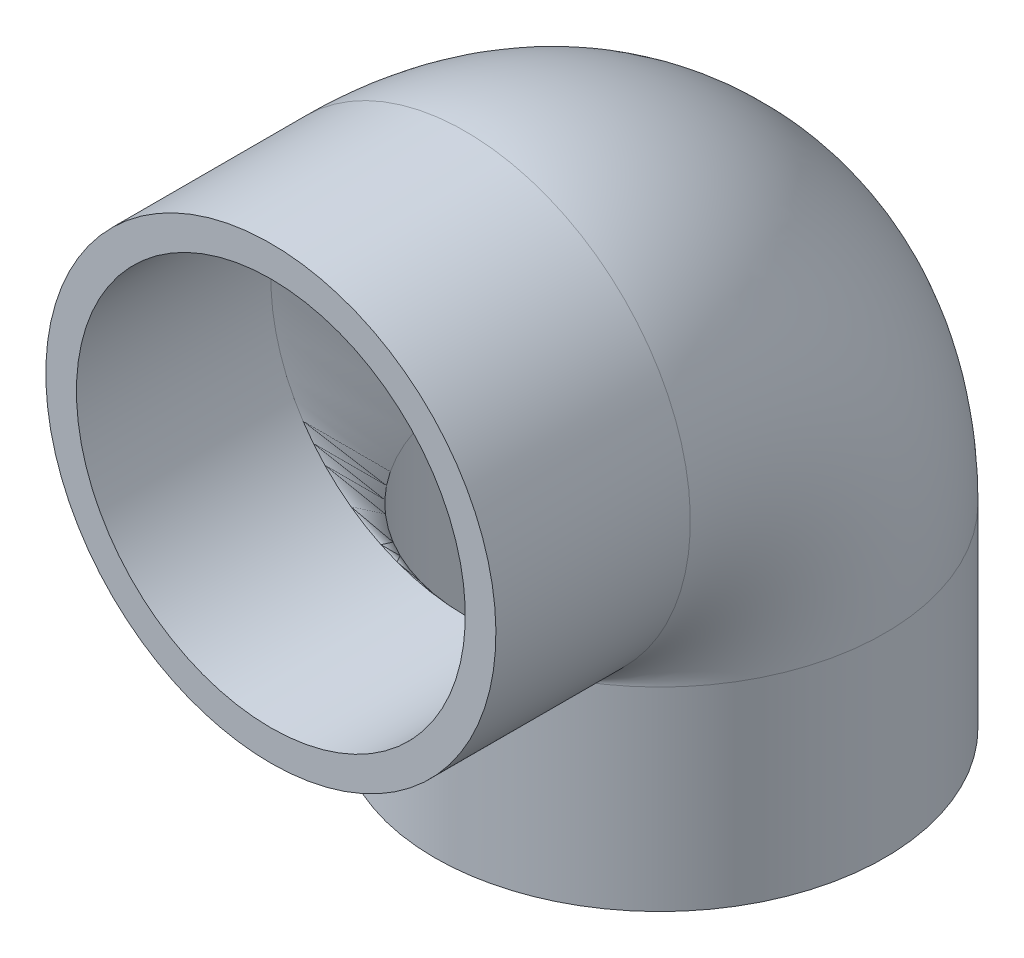
ISO-10303-21;
HEADER;
FILE_DESCRIPTION(('STEP AP214'),'2;1');
FILE_NAME('part.step','',(''),(''),'','','');
FILE_SCHEMA(('AUTOMOTIVE_DESIGN { 1 0 10303 214 1 1 1 1 }'));
ENDSEC;
DATA;
#1=APPLICATION_CONTEXT('core data for automotive mechanical design processes');
#2=APPLICATION_PROTOCOL_DEFINITION('international standard','automotive_design',2000,#1);
#3=PRODUCT_CONTEXT('',#1,'mechanical');
#4=PRODUCT('Part','Part','',(#3));
#5=PRODUCT_RELATED_PRODUCT_CATEGORY('part','',(#4));
#6=PRODUCT_DEFINITION_FORMATION('','',#4);
#7=PRODUCT_DEFINITION_CONTEXT('part definition',#1,'design');
#8=PRODUCT_DEFINITION('design','',#6,#7);
#9=PRODUCT_DEFINITION_SHAPE('','',#8);
#10=(LENGTH_UNIT() NAMED_UNIT(*) SI_UNIT(.MILLI.,.METRE.));
#11=(NAMED_UNIT(*) PLANE_ANGLE_UNIT() SI_UNIT($,.RADIAN.));
#12=(NAMED_UNIT(*) SI_UNIT($,.STERADIAN.) SOLID_ANGLE_UNIT());
#13=UNCERTAINTY_MEASURE_WITH_UNIT(LENGTH_MEASURE(1.E-05),#10,'distance_accuracy_value','');
#14=(GEOMETRIC_REPRESENTATION_CONTEXT(3) GLOBAL_UNCERTAINTY_ASSIGNED_CONTEXT((#13)) GLOBAL_UNIT_ASSIGNED_CONTEXT((#10,
#11,#12)) REPRESENTATION_CONTEXT('',''));
#15=CARTESIAN_POINT('',(0.,0.,0.));
#16=DIRECTION('',(0.,0.,1.));
#17=DIRECTION('',(1.,0.,0.));
#18=AXIS2_PLACEMENT_3D('',#15,#16,#17);
#19=CARTESIAN_POINT('',(0.,-6.35,0.));
#20=DIRECTION('',(0.,-1.,0.));
#21=DIRECTION('',(0.,0.,-1.));
#22=AXIS2_PLACEMENT_3D('',#19,#20,#21);
#23=CYLINDRICAL_SURFACE('',#22,7.35);
#24=CARTESIAN_POINT('',(0.,-12.7,0.));
#25=DIRECTION('',(0.,1.,0.));
#26=DIRECTION('',(0.,0.,1.));
#27=AXIS2_PLACEMENT_3D('',#24,#25,#26);
#28=CIRCLE('',#27,7.35);
#29=CARTESIAN_POINT('',(0.,-12.7,7.35));
#30=VERTEX_POINT('',#29);
#31=EDGE_CURVE('E58',#30,#30,#28,.T.);
#32=ORIENTED_EDGE('',*,*,#31,.T.);
#33=EDGE_LOOP('',(#32));
#34=FACE_BOUND('',#33,.T.);
#35=CARTESIAN_POINT('',(0.,-6.35,0.));
#36=DIRECTION('',(0.,1.,0.));
#37=DIRECTION('',(0.,0.,1.));
#38=AXIS2_PLACEMENT_3D('',#35,#36,#37);
#39=CIRCLE('',#38,7.35);
#40=CARTESIAN_POINT('',(3.70135110466435,-6.35,6.35));
#41=VERTEX_POINT('',#40);
#42=CARTESIAN_POINT('',(-3.70135110466435,-6.35,6.35));
#43=VERTEX_POINT('',#42);
#44=EDGE_CURVE('E90',#41,#43,#39,.T.);
#45=ORIENTED_EDGE('',*,*,#44,.F.);
#46=CARTESIAN_POINT('',(0.,0.,0.));
#47=DIRECTION('',(0.,-0.707106781186547,-0.707106781186548));
#48=DIRECTION('',(0.,0.707106781186548,-0.707106781186547));
#49=AXIS2_PLACEMENT_3D('',#46,#47,#48);
#50=ELLIPSE('',#49,10.3944696834422,7.35);
#51=EDGE_CURVE('E12',#41,#43,#50,.T.);
#52=ORIENTED_EDGE('',*,*,#51,.T.);
#53=EDGE_LOOP('',(#45,#52));
#54=FACE_BOUND('',#53,.T.);
#55=ADVANCED_FACE('F51',(#34,#54),#23,.T.);
#56=CARTESIAN_POINT('',(0.,0.,12.7));
#57=DIRECTION('',(0.,0.,-1.));
#58=DIRECTION('',(-1.,0.,0.));
#59=AXIS2_PLACEMENT_3D('',#56,#57,#58);
#60=CYLINDRICAL_SURFACE('',#59,7.35);
#61=CARTESIAN_POINT('',(0.,0.,12.7));
#62=DIRECTION('',(0.,0.,1.));
#63=DIRECTION('',(0.,-1.,0.));
#64=AXIS2_PLACEMENT_3D('',#61,#62,#63);
#65=CIRCLE('',#64,7.35);
#66=CARTESIAN_POINT('',(0.,-7.35,12.7));
#67=VERTEX_POINT('',#66);
#68=EDGE_CURVE('E87',#67,#67,#65,.T.);
#69=ORIENTED_EDGE('',*,*,#68,.F.);
#70=EDGE_LOOP('',(#69));
#71=FACE_BOUND('',#70,.T.);
#72=ORIENTED_EDGE('',*,*,#51,.F.);
#73=CARTESIAN_POINT('',(0.,0.,6.35));
#74=DIRECTION('',(0.,0.,-1.));
#75=DIRECTION('',(-1.,0.,0.));
#76=AXIS2_PLACEMENT_3D('',#73,#74,#75);
#77=CIRCLE('',#76,7.35);
#78=EDGE_CURVE('E88',#41,#43,#77,.F.);
#79=ORIENTED_EDGE('',*,*,#78,.T.);
#80=EDGE_LOOP('',(#72,#79));
#81=FACE_BOUND('',#80,.T.);
#82=ADVANCED_FACE('F109',(#71,#81),#60,.T.);
#83=CARTESIAN_POINT('',(0.,0.,12.7));
#84=DIRECTION('',(0.,0.,1.));
#85=DIRECTION('',(0.,-1.,0.));
#86=AXIS2_PLACEMENT_3D('',#83,#84,#85);
#87=PLANE('',#86);
#88=CARTESIAN_POINT('',(0.,0.,12.7));
#89=DIRECTION('',(0.,0.,1.));
#90=DIRECTION('',(0.,-1.,0.));
#91=AXIS2_PLACEMENT_3D('',#88,#89,#90);
#92=CIRCLE('',#91,6.35);
#93=CARTESIAN_POINT('',(0.,-6.35,12.7));
#94=VERTEX_POINT('',#93);
#95=EDGE_CURVE('E78',#94,#94,#92,.T.);
#96=ORIENTED_EDGE('',*,*,#95,.F.);
#97=EDGE_LOOP('',(#96));
#98=FACE_BOUND('',#97,.T.);
#99=ORIENTED_EDGE('',*,*,#68,.T.);
#100=EDGE_LOOP('',(#99));
#101=FACE_BOUND('',#100,.T.);
#102=ADVANCED_FACE('F101',(#98,#101),#87,.T.);
#103=CARTESIAN_POINT('',(0.,-12.7,0.));
#104=DIRECTION('',(0.,1.,0.));
#105=DIRECTION('',(0.,0.,1.));
#106=AXIS2_PLACEMENT_3D('',#103,#104,#105);
#107=PLANE('',#106);
#108=CARTESIAN_POINT('',(0.,-12.7,0.));
#109=DIRECTION('',(0.,1.,0.));
#110=DIRECTION('',(0.,0.,1.));
#111=AXIS2_PLACEMENT_3D('',#108,#109,#110);
#112=CIRCLE('',#111,6.35);
#113=CARTESIAN_POINT('',(0.,-12.7,6.35));
#114=VERTEX_POINT('',#113);
#115=EDGE_CURVE('E80',#114,#114,#112,.T.);
#116=ORIENTED_EDGE('',*,*,#115,.T.);
#117=EDGE_LOOP('',(#116));
#118=FACE_BOUND('',#117,.T.);
#119=ORIENTED_EDGE('',*,*,#31,.F.);
#120=EDGE_LOOP('',(#119));
#121=FACE_BOUND('',#120,.T.);
#122=ADVANCED_FACE('F98',(#118,#121),#107,.F.);
#123=CARTESIAN_POINT('',(0.,-6.35,12.7));
#124=DIRECTION('',(0.,-1.,0.));
#125=DIRECTION('',(0.,0.,1.));
#126=AXIS2_PLACEMENT_3D('',#123,#124,#125);
#127=CIRCLE('',#126,7.35);
#128=TRIMMED_CURVE('',#127,(PARAMETER_VALUE(-2.61384909265951)),
(PARAMETER_VALUE(2.61384909265951)),.T.,.PARAMETER.);
#129=CARTESIAN_POINT('',(0.,-6.35,6.35));
#130=DIRECTION('',(-1.,0.,0.));
#131=AXIS1_PLACEMENT('',#129,#130);
#132=SURFACE_OF_REVOLUTION('',#128,#131);
#133=ORIENTED_EDGE('',*,*,#44,.T.);
#134=ORIENTED_EDGE('',*,*,#78,.F.);
#135=EDGE_LOOP('',(#133,#134));
#136=FACE_BOUND('',#135,.T.);
#137=ADVANCED_FACE('F100',(#136),#132,.T.);
#138=CARTESIAN_POINT('',(0.,0.,12.7));
#139=DIRECTION('',(0.,0.,-1.));
#140=DIRECTION('',(-1.,0.,0.));
#141=AXIS2_PLACEMENT_3D('',#138,#139,#140);
#142=CYLINDRICAL_SURFACE('',#141,6.35);
#143=CARTESIAN_POINT('',(0.,0.,6.35));
#144=DIRECTION('',(0.,0.,1.));
#145=DIRECTION('',(0.,-1.,0.));
#146=AXIS2_PLACEMENT_3D('',#143,#144,#145);
#147=CIRCLE('',#146,6.35);
#148=CARTESIAN_POINT('',(0.,-6.35,6.35));
#149=VERTEX_POINT('',#148);
#150=EDGE_CURVE('E71',#149,#149,#147,.T.);
#151=ORIENTED_EDGE('',*,*,#150,.F.);
#152=EDGE_LOOP('',(#151));
#153=FACE_BOUND('',#152,.T.);
#154=ORIENTED_EDGE('',*,*,#95,.T.);
#155=EDGE_LOOP('',(#154));
#156=FACE_BOUND('',#155,.T.);
#157=ADVANCED_FACE('F72',(#153,#156),#142,.F.);
#158=CARTESIAN_POINT('',(0.,-6.35,6.35));
#159=DIRECTION('',(-1.,0.,0.));
#160=DIRECTION('',(0.,0.,1.));
#161=AXIS2_PLACEMENT_3D('',#158,#159,#160);
#162=DEGENERATE_TOROIDAL_SURFACE('',#161,6.35,6.35,.T.);
#163=CARTESIAN_POINT('',(0.,-6.35,0.));
#164=DIRECTION('',(0.,1.,0.));
#165=DIRECTION('',(0.,0.,1.));
#166=AXIS2_PLACEMENT_3D('',#163,#164,#165);
#167=CIRCLE('',#166,6.35);
#168=EDGE_CURVE('E77',#149,#149,#167,.T.);
#169=ORIENTED_EDGE('',*,*,#168,.F.);
#170=ORIENTED_EDGE('',*,*,#150,.T.);
#171=EDGE_LOOP('',(#169,#170));
#172=FACE_BOUND('',#171,.T.);
#173=ADVANCED_FACE('F150',(#172),#162,.F.);
#174=CARTESIAN_POINT('',(0.,-6.35,0.));
#175=DIRECTION('',(0.,-1.,0.));
#176=DIRECTION('',(0.,0.,-1.));
#177=AXIS2_PLACEMENT_3D('',#174,#175,#176);
#178=CYLINDRICAL_SURFACE('',#177,6.35);
#179=ORIENTED_EDGE('',*,*,#115,.F.);
#180=EDGE_LOOP('',(#179));
#181=FACE_BOUND('',#180,.T.);
#182=ORIENTED_EDGE('',*,*,#168,.T.);
#183=EDGE_LOOP('',(#182));
#184=FACE_BOUND('',#183,.T.);
#185=ADVANCED_FACE('F112',(#181,#184),#178,.F.);
#186=CLOSED_SHELL('',(#55,#82,#102,#122,#137,#157,#173,#185));
#187=MANIFOLD_SOLID_BREP('B2',#186);
#188=ADVANCED_BREP_SHAPE_REPRESENTATION('',(#18,#187),#14);
#189=SHAPE_DEFINITION_REPRESENTATION(#9,#188);
ENDSEC;
END-ISO-10303-21;
